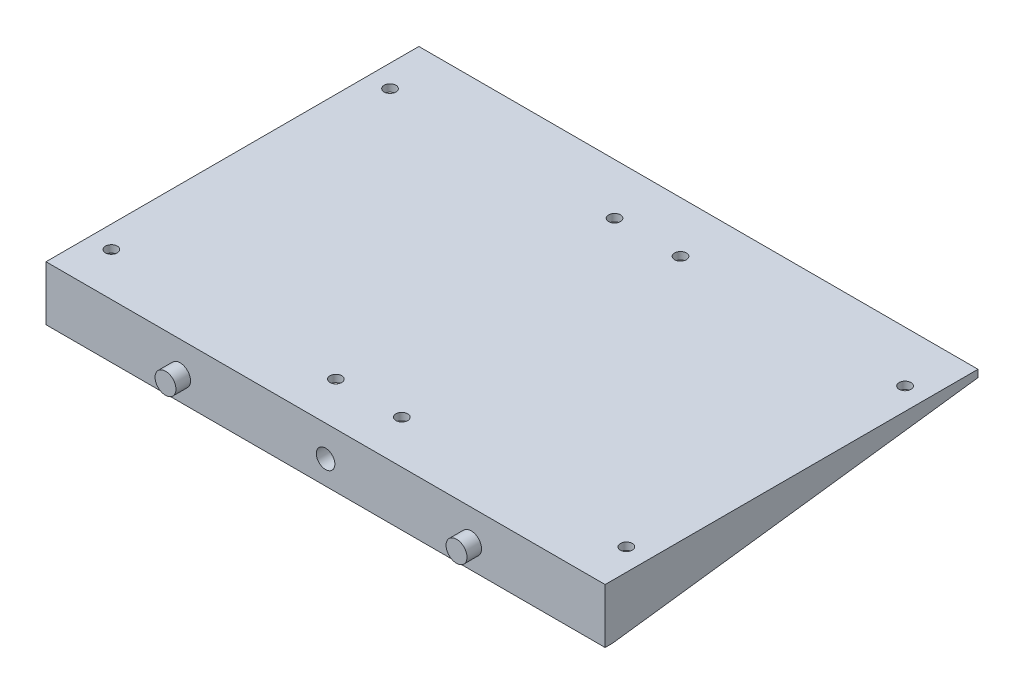
ISO-10303-21;
HEADER;
FILE_DESCRIPTION(('STEP AP214'),'2;1');
FILE_NAME('part.step','',(''),(''),'','','');
FILE_SCHEMA(('AUTOMOTIVE_DESIGN { 1 0 10303 214 1 1 1 1 }'));
ENDSEC;
DATA;
#1=APPLICATION_CONTEXT('core data for automotive mechanical design processes');
#2=APPLICATION_PROTOCOL_DEFINITION('international standard','automotive_design',2000,#1);
#3=PRODUCT_CONTEXT('',#1,'mechanical');
#4=PRODUCT('Part','Part','',(#3));
#5=PRODUCT_RELATED_PRODUCT_CATEGORY('part','',(#4));
#6=PRODUCT_DEFINITION_FORMATION('','',#4);
#7=PRODUCT_DEFINITION_CONTEXT('part definition',#1,'design');
#8=PRODUCT_DEFINITION('design','',#6,#7);
#9=PRODUCT_DEFINITION_SHAPE('','',#8);
#10=(LENGTH_UNIT() NAMED_UNIT(*) SI_UNIT(.MILLI.,.METRE.));
#11=(NAMED_UNIT(*) PLANE_ANGLE_UNIT() SI_UNIT($,.RADIAN.));
#12=(NAMED_UNIT(*) SI_UNIT($,.STERADIAN.) SOLID_ANGLE_UNIT());
#13=UNCERTAINTY_MEASURE_WITH_UNIT(LENGTH_MEASURE(1.E-05),#10,'distance_accuracy_value','');
#14=(GEOMETRIC_REPRESENTATION_CONTEXT(3) GLOBAL_UNCERTAINTY_ASSIGNED_CONTEXT((#13)) GLOBAL_UNIT_ASSIGNED_CONTEXT((#10,
#11,#12)) REPRESENTATION_CONTEXT('',''));
#15=CARTESIAN_POINT('',(0.,0.,0.));
#16=DIRECTION('',(0.,0.,1.));
#17=DIRECTION('',(1.,0.,0.));
#18=AXIS2_PLACEMENT_3D('',#15,#16,#17);
#19=CARTESIAN_POINT('',(0.,0.,0.));
#20=DIRECTION('',(0.,0.,1.));
#21=DIRECTION('',(1.,0.,0.));
#22=AXIS2_PLACEMENT_3D('',#19,#20,#21);
#23=PLANE('',#22);
#24=DIRECTION('',(0.,-1.,0.));
#25=VECTOR('',#24,1.);
#26=CARTESIAN_POINT('',(149.7,-13.,0.));
#27=LINE('',#26,#25);
#28=CARTESIAN_POINT('',(149.7,0.,0.));
#29=VERTEX_POINT('',#28);
#30=CARTESIAN_POINT('',(149.7,-13.,0.));
#31=VERTEX_POINT('',#30);
#32=EDGE_CURVE('E198',#29,#31,#27,.T.);
#33=ORIENTED_EDGE('',*,*,#32,.T.);
#34=DIRECTION('',(1.,0.,0.));
#35=VECTOR('',#34,1.);
#36=CARTESIAN_POINT('',(0.,-13.,0.));
#37=LINE('',#36,#35);
#38=CARTESIAN_POINT('',(0.,-13.,0.));
#39=VERTEX_POINT('',#38);
#40=EDGE_CURVE('E133',#39,#31,#37,.T.);
#41=ORIENTED_EDGE('',*,*,#40,.F.);
#42=DIRECTION('',(0.,1.,0.));
#43=VECTOR('',#42,1.);
#44=CARTESIAN_POINT('',(0.,0.,0.));
#45=LINE('',#44,#43);
#46=CARTESIAN_POINT('',(0.,0.,0.));
#47=VERTEX_POINT('',#46);
#48=EDGE_CURVE('E60',#39,#47,#45,.T.);
#49=ORIENTED_EDGE('',*,*,#48,.T.);
#50=DIRECTION('',(1.,0.,0.));
#51=VECTOR('',#50,1.);
#52=CARTESIAN_POINT('',(0.,0.,0.));
#53=LINE('',#52,#51);
#54=EDGE_CURVE('E182',#47,#29,#53,.T.);
#55=ORIENTED_EDGE('',*,*,#54,.T.);
#56=EDGE_LOOP('',(#33,#41,#49,#55));
#57=FACE_BOUND('',#56,.T.);
#58=CARTESIAN_POINT('',(74.85,-6.5,0.));
#59=DIRECTION('',(0.,0.,1.));
#60=DIRECTION('',(1.,0.,0.));
#61=AXIS2_PLACEMENT_3D('',#58,#59,#60);
#62=CIRCLE('',#61,4.00000000000001);
#63=CARTESIAN_POINT('',(78.85,-6.5,0.));
#64=VERTEX_POINT('',#63);
#65=EDGE_CURVE('E11',#64,#64,#62,.F.);
#66=ORIENTED_EDGE('',*,*,#65,.F.);
#67=EDGE_LOOP('',(#66));
#68=FACE_BOUND('',#67,.T.);
#69=ADVANCED_FACE('F37',(#57,#68),#23,.F.);
#70=CARTESIAN_POINT('',(0.,2.,-100.5));
#71=DIRECTION('',(0.,0.,-1.));
#72=DIRECTION('',(-1.,0.,0.));
#73=AXIS2_PLACEMENT_3D('',#70,#71,#72);
#74=PLANE('',#73);
#75=DIRECTION('',(1.,0.,0.));
#76=VECTOR('',#75,1.);
#77=CARTESIAN_POINT('',(0.,0.,-100.5));
#78=LINE('',#77,#76);
#79=CARTESIAN_POINT('',(0.,0.,-100.5));
#80=VERTEX_POINT('',#79);
#81=CARTESIAN_POINT('',(149.7,0.,-100.5));
#82=VERTEX_POINT('',#81);
#83=EDGE_CURVE('E52',#80,#82,#78,.T.);
#84=ORIENTED_EDGE('',*,*,#83,.F.);
#85=DIRECTION('',(1.,0.,0.));
#86=VECTOR('',#85,1.);
#87=CARTESIAN_POINT('',(-2.,0.,-100.5));
#88=LINE('',#87,#86);
#89=CARTESIAN_POINT('',(-2.,0.,-100.5));
#90=VERTEX_POINT('',#89);
#91=EDGE_CURVE('E231',#90,#80,#88,.T.);
#92=ORIENTED_EDGE('',*,*,#91,.F.);
#93=DIRECTION('',(0.,-1.,0.));
#94=VECTOR('',#93,1.);
#95=CARTESIAN_POINT('',(-2.,0.,-100.5));
#96=LINE('',#95,#94);
#97=CARTESIAN_POINT('',(-2.,2.,-100.5));
#98=VERTEX_POINT('',#97);
#99=EDGE_CURVE('E116',#98,#90,#96,.T.);
#100=ORIENTED_EDGE('',*,*,#99,.F.);
#101=DIRECTION('',(1.,0.,0.));
#102=VECTOR('',#101,1.);
#103=CARTESIAN_POINT('',(0.,2.,-100.5));
#104=LINE('',#103,#102);
#105=CARTESIAN_POINT('',(151.7,2.,-100.5));
#106=VERTEX_POINT('',#105);
#107=EDGE_CURVE('E113',#98,#106,#104,.T.);
#108=ORIENTED_EDGE('',*,*,#107,.T.);
#109=DIRECTION('',(0.,1.,0.));
#110=VECTOR('',#109,1.);
#111=CARTESIAN_POINT('',(151.7,2.,-100.5));
#112=LINE('',#111,#110);
#113=CARTESIAN_POINT('',(151.7,0.,-100.5));
#114=VERTEX_POINT('',#113);
#115=EDGE_CURVE('E215',#114,#106,#112,.T.);
#116=ORIENTED_EDGE('',*,*,#115,.F.);
#117=DIRECTION('',(-1.,0.,0.));
#118=VECTOR('',#117,1.);
#119=CARTESIAN_POINT('',(151.7,0.,-100.5));
#120=LINE('',#119,#118);
#121=EDGE_CURVE('E221',#114,#82,#120,.T.);
#122=ORIENTED_EDGE('',*,*,#121,.T.);
#123=EDGE_LOOP('',(#84,#92,#100,#108,#116,#122));
#124=FACE_BOUND('',#123,.T.);
#125=ADVANCED_FACE('F258',(#124),#74,.T.);
#126=CARTESIAN_POINT('',(83.92,2.,-9.90000000000002));
#127=DIRECTION('',(0.,-1.,0.));
#128=DIRECTION('',(0.,0.,-1.));
#129=AXIS2_PLACEMENT_3D('',#126,#127,#128);
#130=CYLINDRICAL_SURFACE('',#129,1.62499999999999);
#131=CARTESIAN_POINT('',(83.92,2.,-9.90000000000002));
#132=DIRECTION('',(0.,1.,0.));
#133=DIRECTION('',(0.,0.,1.));
#134=AXIS2_PLACEMENT_3D('',#131,#132,#133);
#135=CIRCLE('',#134,1.62499999999999);
#136=CARTESIAN_POINT('',(83.92,2.,-8.27500000000003));
#137=VERTEX_POINT('',#136);
#138=EDGE_CURVE('E163',#137,#137,#135,.T.);
#139=ORIENTED_EDGE('',*,*,#138,.T.);
#140=EDGE_LOOP('',(#139));
#141=FACE_BOUND('',#140,.T.);
#142=CARTESIAN_POINT('',(83.92,0.,-9.90000000000002));
#143=DIRECTION('',(0.,1.,0.));
#144=DIRECTION('',(0.,0.,1.));
#145=AXIS2_PLACEMENT_3D('',#142,#143,#144);
#146=CIRCLE('',#145,1.62499999999999);
#147=CARTESIAN_POINT('',(83.92,0.,-8.27500000000003));
#148=VERTEX_POINT('',#147);
#149=EDGE_CURVE('E192',#148,#148,#146,.T.);
#150=ORIENTED_EDGE('',*,*,#149,.F.);
#151=EDGE_LOOP('',(#150));
#152=FACE_BOUND('',#151,.T.);
#153=ADVANCED_FACE('F263',(#141,#152),#130,.F.);
#154=CARTESIAN_POINT('',(83.92,2.,-86.5));
#155=DIRECTION('',(0.,-1.,0.));
#156=DIRECTION('',(0.,0.,-1.));
#157=AXIS2_PLACEMENT_3D('',#154,#155,#156);
#158=CYLINDRICAL_SURFACE('',#157,1.62499999999999);
#159=CARTESIAN_POINT('',(83.92,2.,-86.5));
#160=DIRECTION('',(0.,1.,0.));
#161=DIRECTION('',(0.,0.,1.));
#162=AXIS2_PLACEMENT_3D('',#159,#160,#161);
#163=CIRCLE('',#162,1.62499999999999);
#164=CARTESIAN_POINT('',(83.92,2.,-84.875));
#165=VERTEX_POINT('',#164);
#166=EDGE_CURVE('E160',#165,#165,#163,.T.);
#167=ORIENTED_EDGE('',*,*,#166,.T.);
#168=EDGE_LOOP('',(#167));
#169=FACE_BOUND('',#168,.T.);
#170=CARTESIAN_POINT('',(83.92,0.,-86.5));
#171=DIRECTION('',(0.,1.,0.));
#172=DIRECTION('',(0.,0.,1.));
#173=AXIS2_PLACEMENT_3D('',#170,#171,#172);
#174=CIRCLE('',#173,1.62499999999999);
#175=CARTESIAN_POINT('',(83.92,0.,-84.875));
#176=VERTEX_POINT('',#175);
#177=EDGE_CURVE('E189',#176,#176,#174,.T.);
#178=ORIENTED_EDGE('',*,*,#177,.F.);
#179=EDGE_LOOP('',(#178));
#180=FACE_BOUND('',#179,.T.);
#181=ADVANCED_FACE('F280',(#169,#180),#158,.F.);
#182=CARTESIAN_POINT('',(145.64,2.,-86.5));
#183=DIRECTION('',(0.,-1.,0.));
#184=DIRECTION('',(0.,0.,-1.));
#185=AXIS2_PLACEMENT_3D('',#182,#183,#184);
#186=CYLINDRICAL_SURFACE('',#185,1.62499999999998);
#187=CARTESIAN_POINT('',(145.64,2.,-86.5));
#188=DIRECTION('',(0.,1.,0.));
#189=DIRECTION('',(0.,0.,1.));
#190=AXIS2_PLACEMENT_3D('',#187,#188,#189);
#191=CIRCLE('',#190,1.62499999999998);
#192=CARTESIAN_POINT('',(145.64,2.,-84.875));
#193=VERTEX_POINT('',#192);
#194=EDGE_CURVE('E157',#193,#193,#191,.T.);
#195=ORIENTED_EDGE('',*,*,#194,.T.);
#196=EDGE_LOOP('',(#195));
#197=FACE_BOUND('',#196,.T.);
#198=CARTESIAN_POINT('',(145.64,0.,-86.5));
#199=DIRECTION('',(0.,1.,0.));
#200=DIRECTION('',(0.,0.,1.));
#201=AXIS2_PLACEMENT_3D('',#198,#199,#200);
#202=CIRCLE('',#201,1.62499999999998);
#203=CARTESIAN_POINT('',(145.64,0.,-84.875));
#204=VERTEX_POINT('',#203);
#205=EDGE_CURVE('E186',#204,#204,#202,.T.);
#206=ORIENTED_EDGE('',*,*,#205,.F.);
#207=EDGE_LOOP('',(#206));
#208=FACE_BOUND('',#207,.T.);
#209=ADVANCED_FACE('F284',(#197,#208),#186,.F.);
#210=CARTESIAN_POINT('',(4.07,2.,-86.5));
#211=DIRECTION('',(0.,-1.,0.));
#212=DIRECTION('',(0.,0.,-1.));
#213=AXIS2_PLACEMENT_3D('',#210,#211,#212);
#214=CYLINDRICAL_SURFACE('',#213,1.625);
#215=CARTESIAN_POINT('',(4.07,2.,-86.5));
#216=DIRECTION('',(0.,1.,0.));
#217=DIRECTION('',(0.,0.,1.));
#218=AXIS2_PLACEMENT_3D('',#215,#216,#217);
#219=CIRCLE('',#218,1.625);
#220=CARTESIAN_POINT('',(4.07,2.,-84.875));
#221=VERTEX_POINT('',#220);
#222=EDGE_CURVE('E153',#221,#221,#219,.T.);
#223=ORIENTED_EDGE('',*,*,#222,.T.);
#224=EDGE_LOOP('',(#223));
#225=FACE_BOUND('',#224,.T.);
#226=CARTESIAN_POINT('',(4.07,0.,-86.5));
#227=DIRECTION('',(0.,1.,0.));
#228=DIRECTION('',(0.,0.,1.));
#229=AXIS2_PLACEMENT_3D('',#226,#227,#228);
#230=CIRCLE('',#229,1.625);
#231=CARTESIAN_POINT('',(4.07,0.,-84.875));
#232=VERTEX_POINT('',#231);
#233=EDGE_CURVE('E176',#232,#232,#230,.T.);
#234=ORIENTED_EDGE('',*,*,#233,.F.);
#235=EDGE_LOOP('',(#234));
#236=FACE_BOUND('',#235,.T.);
#237=ADVANCED_FACE('F287',(#225,#236),#214,.F.);
#238=CARTESIAN_POINT('',(65.79,2.,-86.5));
#239=DIRECTION('',(0.,-1.,0.));
#240=DIRECTION('',(0.,0.,-1.));
#241=AXIS2_PLACEMENT_3D('',#238,#239,#240);
#242=CYLINDRICAL_SURFACE('',#241,1.62499999999999);
#243=CARTESIAN_POINT('',(65.79,2.,-86.5));
#244=DIRECTION('',(0.,1.,0.));
#245=DIRECTION('',(0.,0.,1.));
#246=AXIS2_PLACEMENT_3D('',#243,#244,#245);
#247=CIRCLE('',#246,1.62499999999999);
#248=CARTESIAN_POINT('',(65.79,2.,-84.875));
#249=VERTEX_POINT('',#248);
#250=EDGE_CURVE('E150',#249,#249,#247,.T.);
#251=ORIENTED_EDGE('',*,*,#250,.T.);
#252=EDGE_LOOP('',(#251));
#253=FACE_BOUND('',#252,.T.);
#254=CARTESIAN_POINT('',(65.79,0.,-86.5));
#255=DIRECTION('',(0.,1.,0.));
#256=DIRECTION('',(0.,0.,1.));
#257=AXIS2_PLACEMENT_3D('',#254,#255,#256);
#258=CIRCLE('',#257,1.62499999999999);
#259=CARTESIAN_POINT('',(65.79,0.,-84.875));
#260=VERTEX_POINT('',#259);
#261=EDGE_CURVE('E173',#260,#260,#258,.T.);
#262=ORIENTED_EDGE('',*,*,#261,.F.);
#263=EDGE_LOOP('',(#262));
#264=FACE_BOUND('',#263,.T.);
#265=ADVANCED_FACE('F292',(#253,#264),#242,.F.);
#266=CARTESIAN_POINT('',(4.07,2.,-9.90000000000002));
#267=DIRECTION('',(0.,-1.,0.));
#268=DIRECTION('',(0.,0.,-1.));
#269=AXIS2_PLACEMENT_3D('',#266,#267,#268);
#270=CYLINDRICAL_SURFACE('',#269,1.625);
#271=CARTESIAN_POINT('',(4.07,2.,-9.90000000000002));
#272=DIRECTION('',(0.,1.,0.));
#273=DIRECTION('',(0.,0.,1.));
#274=AXIS2_PLACEMENT_3D('',#271,#272,#273);
#275=CIRCLE('',#274,1.625);
#276=CARTESIAN_POINT('',(4.07,2.,-8.27500000000002));
#277=VERTEX_POINT('',#276);
#278=EDGE_CURVE('E146',#277,#277,#275,.T.);
#279=ORIENTED_EDGE('',*,*,#278,.T.);
#280=EDGE_LOOP('',(#279));
#281=FACE_BOUND('',#280,.T.);
#282=CARTESIAN_POINT('',(4.07,0.,-9.90000000000002));
#283=DIRECTION('',(0.,1.,0.));
#284=DIRECTION('',(0.,0.,1.));
#285=AXIS2_PLACEMENT_3D('',#282,#283,#284);
#286=CIRCLE('',#285,1.625);
#287=CARTESIAN_POINT('',(4.07,0.,-8.27500000000002));
#288=VERTEX_POINT('',#287);
#289=EDGE_CURVE('E170',#288,#288,#286,.T.);
#290=ORIENTED_EDGE('',*,*,#289,.F.);
#291=EDGE_LOOP('',(#290));
#292=FACE_BOUND('',#291,.T.);
#293=ADVANCED_FACE('F295',(#281,#292),#270,.F.);
#294=CARTESIAN_POINT('',(65.79,2.,-9.90000000000002));
#295=DIRECTION('',(0.,-1.,0.));
#296=DIRECTION('',(0.,0.,-1.));
#297=AXIS2_PLACEMENT_3D('',#294,#295,#296);
#298=CYLINDRICAL_SURFACE('',#297,1.625);
#299=CARTESIAN_POINT('',(65.79,2.,-9.90000000000002));
#300=DIRECTION('',(0.,1.,0.));
#301=DIRECTION('',(0.,0.,1.));
#302=AXIS2_PLACEMENT_3D('',#299,#300,#301);
#303=CIRCLE('',#302,1.625);
#304=CARTESIAN_POINT('',(65.79,2.,-8.27500000000002));
#305=VERTEX_POINT('',#304);
#306=EDGE_CURVE('E143',#305,#305,#303,.T.);
#307=ORIENTED_EDGE('',*,*,#306,.T.);
#308=EDGE_LOOP('',(#307));
#309=FACE_BOUND('',#308,.T.);
#310=CARTESIAN_POINT('',(65.79,0.,-9.90000000000002));
#311=DIRECTION('',(0.,1.,0.));
#312=DIRECTION('',(0.,0.,1.));
#313=AXIS2_PLACEMENT_3D('',#310,#311,#312);
#314=CIRCLE('',#313,1.625);
#315=CARTESIAN_POINT('',(65.79,0.,-8.27500000000002));
#316=VERTEX_POINT('',#315);
#317=EDGE_CURVE('E135',#316,#316,#314,.T.);
#318=ORIENTED_EDGE('',*,*,#317,.F.);
#319=EDGE_LOOP('',(#318));
#320=FACE_BOUND('',#319,.T.);
#321=ADVANCED_FACE('F39',(#309,#320),#298,.F.);
#322=CARTESIAN_POINT('',(145.64,2.,-9.90000000000002));
#323=DIRECTION('',(0.,-1.,0.));
#324=DIRECTION('',(0.,0.,-1.));
#325=AXIS2_PLACEMENT_3D('',#322,#323,#324);
#326=CYLINDRICAL_SURFACE('',#325,1.625);
#327=CARTESIAN_POINT('',(145.64,2.,-9.90000000000002));
#328=DIRECTION('',(0.,1.,0.));
#329=DIRECTION('',(0.,0.,1.));
#330=AXIS2_PLACEMENT_3D('',#327,#328,#329);
#331=CIRCLE('',#330,1.625);
#332=CARTESIAN_POINT('',(145.64,2.,-8.27500000000002));
#333=VERTEX_POINT('',#332);
#334=EDGE_CURVE('E45',#333,#333,#331,.T.);
#335=ORIENTED_EDGE('',*,*,#334,.T.);
#336=EDGE_LOOP('',(#335));
#337=FACE_BOUND('',#336,.T.);
#338=CARTESIAN_POINT('',(145.64,0.,-9.90000000000002));
#339=DIRECTION('',(0.,1.,0.));
#340=DIRECTION('',(0.,0.,1.));
#341=AXIS2_PLACEMENT_3D('',#338,#339,#340);
#342=CIRCLE('',#341,1.625);
#343=CARTESIAN_POINT('',(145.64,0.,-8.27500000000002));
#344=VERTEX_POINT('',#343);
#345=EDGE_CURVE('E147',#344,#344,#342,.T.);
#346=ORIENTED_EDGE('',*,*,#345,.F.);
#347=EDGE_LOOP('',(#346));
#348=FACE_BOUND('',#347,.T.);
#349=ADVANCED_FACE('F271',(#337,#348),#326,.F.);
#350=CARTESIAN_POINT('',(0.,2.,0.));
#351=DIRECTION('',(0.,1.,0.));
#352=DIRECTION('',(0.,0.,1.));
#353=AXIS2_PLACEMENT_3D('',#350,#351,#352);
#354=PLANE('',#353);
#355=DIRECTION('',(1.,0.,0.));
#356=VECTOR('',#355,1.);
#357=CARTESIAN_POINT('',(0.,2.,2.));
#358=LINE('',#357,#356);
#359=CARTESIAN_POINT('',(-2.,2.,2.));
#360=VERTEX_POINT('',#359);
#361=CARTESIAN_POINT('',(151.7,2.,2.));
#362=VERTEX_POINT('',#361);
#363=EDGE_CURVE('E112',#360,#362,#358,.T.);
#364=ORIENTED_EDGE('',*,*,#363,.T.);
#365=DIRECTION('',(0.,0.,1.));
#366=VECTOR('',#365,1.);
#367=CARTESIAN_POINT('',(151.7,2.,0.));
#368=LINE('',#367,#366);
#369=EDGE_CURVE('E218',#106,#362,#368,.T.);
#370=ORIENTED_EDGE('',*,*,#369,.F.);
#371=ORIENTED_EDGE('',*,*,#107,.F.);
#372=DIRECTION('',(0.,0.,-1.));
#373=VECTOR('',#372,1.);
#374=CARTESIAN_POINT('',(-2.,2.,0.));
#375=LINE('',#374,#373);
#376=EDGE_CURVE('E106',#360,#98,#375,.T.);
#377=ORIENTED_EDGE('',*,*,#376,.F.);
#378=EDGE_LOOP('',(#364,#370,#371,#377));
#379=FACE_BOUND('',#378,.T.);
#380=ORIENTED_EDGE('',*,*,#306,.F.);
#381=EDGE_LOOP('',(#380));
#382=FACE_BOUND('',#381,.T.);
#383=ORIENTED_EDGE('',*,*,#278,.F.);
#384=EDGE_LOOP('',(#383));
#385=FACE_BOUND('',#384,.T.);
#386=ORIENTED_EDGE('',*,*,#250,.F.);
#387=EDGE_LOOP('',(#386));
#388=FACE_BOUND('',#387,.T.);
#389=ORIENTED_EDGE('',*,*,#222,.F.);
#390=EDGE_LOOP('',(#389));
#391=FACE_BOUND('',#390,.T.);
#392=ORIENTED_EDGE('',*,*,#194,.F.);
#393=EDGE_LOOP('',(#392));
#394=FACE_BOUND('',#393,.T.);
#395=ORIENTED_EDGE('',*,*,#166,.F.);
#396=EDGE_LOOP('',(#395));
#397=FACE_BOUND('',#396,.T.);
#398=ORIENTED_EDGE('',*,*,#138,.F.);
#399=EDGE_LOOP('',(#398));
#400=FACE_BOUND('',#399,.T.);
#401=ORIENTED_EDGE('',*,*,#334,.F.);
#402=EDGE_LOOP('',(#401));
#403=FACE_BOUND('',#402,.T.);
#404=ADVANCED_FACE('F108',(#379,#382,#385,#388,#391,#394,#397,#400,#403),#354,.T.);
#405=CARTESIAN_POINT('',(0.,0.,0.));
#406=DIRECTION('',(0.,1.,0.));
#407=DIRECTION('',(0.,0.,1.));
#408=AXIS2_PLACEMENT_3D('',#405,#406,#407);
#409=PLANE('',#408);
#410=ORIENTED_EDGE('',*,*,#317,.T.);
#411=EDGE_LOOP('',(#410));
#412=FACE_BOUND('',#411,.T.);
#413=ORIENTED_EDGE('',*,*,#289,.T.);
#414=EDGE_LOOP('',(#413));
#415=FACE_BOUND('',#414,.T.);
#416=ORIENTED_EDGE('',*,*,#261,.T.);
#417=EDGE_LOOP('',(#416));
#418=FACE_BOUND('',#417,.T.);
#419=ORIENTED_EDGE('',*,*,#233,.T.);
#420=EDGE_LOOP('',(#419));
#421=FACE_BOUND('',#420,.T.);
#422=ORIENTED_EDGE('',*,*,#83,.T.);
#423=DIRECTION('',(0.,0.,-1.));
#424=VECTOR('',#423,1.);
#425=CARTESIAN_POINT('',(149.7,0.,0.));
#426=LINE('',#425,#424);
#427=EDGE_CURVE('E184',#29,#82,#426,.T.);
#428=ORIENTED_EDGE('',*,*,#427,.F.);
#429=ORIENTED_EDGE('',*,*,#54,.F.);
#430=DIRECTION('',(0.,0.,-1.));
#431=VECTOR('',#430,1.);
#432=CARTESIAN_POINT('',(0.,0.,0.));
#433=LINE('',#432,#431);
#434=EDGE_CURVE('E180',#47,#80,#433,.T.);
#435=ORIENTED_EDGE('',*,*,#434,.T.);
#436=EDGE_LOOP('',(#422,#428,#429,#435));
#437=FACE_BOUND('',#436,.T.);
#438=ORIENTED_EDGE('',*,*,#205,.T.);
#439=EDGE_LOOP('',(#438));
#440=FACE_BOUND('',#439,.T.);
#441=ORIENTED_EDGE('',*,*,#177,.T.);
#442=EDGE_LOOP('',(#441));
#443=FACE_BOUND('',#442,.T.);
#444=ORIENTED_EDGE('',*,*,#149,.T.);
#445=EDGE_LOOP('',(#444));
#446=FACE_BOUND('',#445,.T.);
#447=ORIENTED_EDGE('',*,*,#345,.T.);
#448=EDGE_LOOP('',(#447));
#449=FACE_BOUND('',#448,.T.);
#450=ADVANCED_FACE('F268',(#412,#415,#418,#421,#437,#440,#443,#446,#449),#409,.F.);
#451=CARTESIAN_POINT('',(0.,-13.,2.));
#452=DIRECTION('',(0.,1.,0.));
#453=DIRECTION('',(0.,0.,1.));
#454=AXIS2_PLACEMENT_3D('',#451,#452,#453);
#455=PLANE('',#454);
#456=DIRECTION('',(-1.,0.,0.));
#457=VECTOR('',#456,1.);
#458=CARTESIAN_POINT('',(151.7,-13.,0.));
#459=LINE('',#458,#457);
#460=CARTESIAN_POINT('',(151.7,-13.,0.));
#461=VERTEX_POINT('',#460);
#462=EDGE_CURVE('E226',#461,#31,#459,.T.);
#463=ORIENTED_EDGE('',*,*,#462,.F.);
#464=DIRECTION('',(0.,0.,1.));
#465=VECTOR('',#464,1.);
#466=CARTESIAN_POINT('',(151.7,-13.,2.));
#467=LINE('',#466,#465);
#468=CARTESIAN_POINT('',(151.7,-13.,2.));
#469=VERTEX_POINT('',#468);
#470=EDGE_CURVE('E335',#461,#469,#467,.T.);
#471=ORIENTED_EDGE('',*,*,#470,.T.);
#472=DIRECTION('',(1.,0.,0.));
#473=VECTOR('',#472,1.);
#474=CARTESIAN_POINT('',(0.,-13.,2.));
#475=LINE('',#474,#473);
#476=CARTESIAN_POINT('',(-2.,-13.,2.));
#477=VERTEX_POINT('',#476);
#478=EDGE_CURVE('E132',#477,#469,#475,.T.);
#479=ORIENTED_EDGE('',*,*,#478,.F.);
#480=DIRECTION('',(0.,0.,-1.));
#481=VECTOR('',#480,1.);
#482=CARTESIAN_POINT('',(-2.,-13.,2.));
#483=LINE('',#482,#481);
#484=CARTESIAN_POINT('',(-2.,-13.,0.));
#485=VERTEX_POINT('',#484);
#486=EDGE_CURVE('E123',#477,#485,#483,.T.);
#487=ORIENTED_EDGE('',*,*,#486,.T.);
#488=DIRECTION('',(1.,0.,0.));
#489=VECTOR('',#488,1.);
#490=CARTESIAN_POINT('',(-2.,-13.,0.));
#491=LINE('',#490,#489);
#492=EDGE_CURVE('E138',#485,#39,#491,.T.);
#493=ORIENTED_EDGE('',*,*,#492,.T.);
#494=ORIENTED_EDGE('',*,*,#40,.T.);
#495=EDGE_LOOP('',(#463,#471,#479,#487,#493,#494));
#496=FACE_BOUND('',#495,.T.);
#497=ADVANCED_FACE('F241',(#496),#455,.F.);
#498=CARTESIAN_POINT('',(0.,0.,2.));
#499=DIRECTION('',(0.,0.,1.));
#500=DIRECTION('',(1.,0.,0.));
#501=AXIS2_PLACEMENT_3D('',#498,#499,#500);
#502=PLANE('',#501);
#503=DIRECTION('',(0.,-1.,0.));
#504=VECTOR('',#503,1.);
#505=CARTESIAN_POINT('',(151.7,0.,2.));
#506=LINE('',#505,#504);
#507=EDGE_CURVE('E127',#362,#469,#506,.T.);
#508=ORIENTED_EDGE('',*,*,#507,.F.);
#509=ORIENTED_EDGE('',*,*,#363,.F.);
#510=DIRECTION('',(0.,1.,0.));
#511=VECTOR('',#510,1.);
#512=CARTESIAN_POINT('',(-2.,0.,2.));
#513=LINE('',#512,#511);
#514=EDGE_CURVE('E120',#477,#360,#513,.T.);
#515=ORIENTED_EDGE('',*,*,#514,.F.);
#516=ORIENTED_EDGE('',*,*,#478,.T.);
#517=EDGE_LOOP('',(#508,#509,#515,#516));
#518=FACE_BOUND('',#517,.T.);
#519=CARTESIAN_POINT('',(34.85,-6.5,2.));
#520=DIRECTION('',(0.,0.,1.));
#521=DIRECTION('',(1.,0.,0.));
#522=AXIS2_PLACEMENT_3D('',#519,#520,#521);
#523=CIRCLE('',#522,2.875);
#524=CARTESIAN_POINT('',(37.725,-6.5,2.));
#525=VERTEX_POINT('',#524);
#526=EDGE_CURVE('E341',#525,#525,#523,.T.);
#527=ORIENTED_EDGE('',*,*,#526,.F.);
#528=EDGE_LOOP('',(#527));
#529=FACE_BOUND('',#528,.T.);
#530=CARTESIAN_POINT('',(114.85,-6.5,2.));
#531=DIRECTION('',(0.,0.,1.));
#532=DIRECTION('',(1.,0.,0.));
#533=AXIS2_PLACEMENT_3D('',#530,#531,#532);
#534=CIRCLE('',#533,2.875);
#535=CARTESIAN_POINT('',(117.725,-6.5,2.));
#536=VERTEX_POINT('',#535);
#537=EDGE_CURVE('E344',#536,#536,#534,.T.);
#538=ORIENTED_EDGE('',*,*,#537,.F.);
#539=EDGE_LOOP('',(#538));
#540=FACE_BOUND('',#539,.T.);
#541=CARTESIAN_POINT('',(74.85,-6.5,2.));
#542=DIRECTION('',(0.,0.,1.));
#543=DIRECTION('',(1.,0.,0.));
#544=AXIS2_PLACEMENT_3D('',#541,#542,#543);
#545=CIRCLE('',#544,2.54999999999999);
#546=CARTESIAN_POINT('',(77.4,-6.5,2.));
#547=VERTEX_POINT('',#546);
#548=EDGE_CURVE('E196',#547,#547,#545,.T.);
#549=ORIENTED_EDGE('',*,*,#548,.F.);
#550=EDGE_LOOP('',(#549));
#551=FACE_BOUND('',#550,.T.);
#552=ADVANCED_FACE('F130',(#518,#529,#540,#551),#502,.T.);
#553=CARTESIAN_POINT('',(0.,0.,0.));
#554=DIRECTION('',(-1.,0.,0.));
#555=DIRECTION('',(0.,0.,1.));
#556=AXIS2_PLACEMENT_3D('',#553,#554,#555);
#557=PLANE('',#556);
#558=DIRECTION('',(0.,-0.128284441850094,0.991737415841114));
#559=VECTOR('',#558,1.);
#560=CARTESIAN_POINT('',(0.,-12.7860603257297,-1.65391825108942));
#561=LINE('',#560,#559);
#562=EDGE_CURVE('E228',#80,#39,#561,.T.);
#563=ORIENTED_EDGE('',*,*,#562,.F.);
#564=ORIENTED_EDGE('',*,*,#434,.F.);
#565=ORIENTED_EDGE('',*,*,#48,.F.);
#566=EDGE_LOOP('',(#563,#564,#565));
#567=FACE_BOUND('',#566,.T.);
#568=ADVANCED_FACE('F245',(#567),#557,.F.);
#569=CARTESIAN_POINT('',(-2.,-12.7860603257297,-1.65391825108942));
#570=DIRECTION('',(0.,0.991737415841114,0.128284441850094));
#571=DIRECTION('',(0.,-0.128284441850094,0.991737415841114));
#572=AXIS2_PLACEMENT_3D('',#569,#570,#571);
#573=PLANE('',#572);
#574=ORIENTED_EDGE('',*,*,#562,.T.);
#575=ORIENTED_EDGE('',*,*,#492,.F.);
#576=DIRECTION('',(0.,-0.128284441850094,0.991737415841114));
#577=VECTOR('',#576,1.);
#578=CARTESIAN_POINT('',(-2.,-12.7860603257297,-1.65391825108942));
#579=LINE('',#578,#577);
#580=EDGE_CURVE('E117',#90,#485,#579,.T.);
#581=ORIENTED_EDGE('',*,*,#580,.F.);
#582=ORIENTED_EDGE('',*,*,#91,.T.);
#583=EDGE_LOOP('',(#574,#575,#581,#582));
#584=FACE_BOUND('',#583,.T.);
#585=ADVANCED_FACE('F246',(#584),#573,.F.);
#586=CARTESIAN_POINT('',(-2.,0.,0.));
#587=DIRECTION('',(-1.,0.,0.));
#588=DIRECTION('',(0.,0.,1.));
#589=AXIS2_PLACEMENT_3D('',#586,#587,#588);
#590=PLANE('',#589);
#591=ORIENTED_EDGE('',*,*,#580,.T.);
#592=ORIENTED_EDGE('',*,*,#486,.F.);
#593=ORIENTED_EDGE('',*,*,#514,.T.);
#594=ORIENTED_EDGE('',*,*,#376,.T.);
#595=ORIENTED_EDGE('',*,*,#99,.T.);
#596=EDGE_LOOP('',(#591,#592,#593,#594,#595));
#597=FACE_BOUND('',#596,.T.);
#598=ADVANCED_FACE('F121',(#597),#590,.T.);
#599=CARTESIAN_POINT('',(149.7,0.,0.));
#600=DIRECTION('',(1.,0.,0.));
#601=DIRECTION('',(0.,0.,-1.));
#602=AXIS2_PLACEMENT_3D('',#599,#600,#601);
#603=PLANE('',#602);
#604=ORIENTED_EDGE('',*,*,#32,.F.);
#605=ORIENTED_EDGE('',*,*,#427,.T.);
#606=DIRECTION('',(0.,0.128284441850094,-0.991737415841113));
#607=VECTOR('',#606,1.);
#608=CARTESIAN_POINT('',(149.7,0.,-100.5));
#609=LINE('',#608,#607);
#610=EDGE_CURVE('E203',#31,#82,#609,.T.);
#611=ORIENTED_EDGE('',*,*,#610,.F.);
#612=EDGE_LOOP('',(#604,#605,#611));
#613=FACE_BOUND('',#612,.T.);
#614=ADVANCED_FACE('F253',(#613),#603,.F.);
#615=CARTESIAN_POINT('',(151.7,0.,-100.5));
#616=DIRECTION('',(0.,0.991737415841114,0.128284441850094));
#617=DIRECTION('',(0.,-0.128284441850094,0.991737415841114));
#618=AXIS2_PLACEMENT_3D('',#615,#616,#617);
#619=PLANE('',#618);
#620=ORIENTED_EDGE('',*,*,#610,.T.);
#621=ORIENTED_EDGE('',*,*,#121,.F.);
#622=DIRECTION('',(0.,0.128284441850094,-0.991737415841113));
#623=VECTOR('',#622,1.);
#624=CARTESIAN_POINT('',(151.7,0.,-100.5));
#625=LINE('',#624,#623);
#626=EDGE_CURVE('E220',#461,#114,#625,.T.);
#627=ORIENTED_EDGE('',*,*,#626,.F.);
#628=ORIENTED_EDGE('',*,*,#462,.T.);
#629=EDGE_LOOP('',(#620,#621,#627,#628));
#630=FACE_BOUND('',#629,.T.);
#631=ADVANCED_FACE('F329',(#630),#619,.F.);
#632=CARTESIAN_POINT('',(151.7,0.,0.));
#633=DIRECTION('',(1.,0.,0.));
#634=DIRECTION('',(0.,0.,-1.));
#635=AXIS2_PLACEMENT_3D('',#632,#633,#634);
#636=PLANE('',#635);
#637=ORIENTED_EDGE('',*,*,#369,.T.);
#638=ORIENTED_EDGE('',*,*,#507,.T.);
#639=ORIENTED_EDGE('',*,*,#470,.F.);
#640=ORIENTED_EDGE('',*,*,#626,.T.);
#641=ORIENTED_EDGE('',*,*,#115,.T.);
#642=EDGE_LOOP('',(#637,#638,#639,#640,#641));
#643=FACE_BOUND('',#642,.T.);
#644=ADVANCED_FACE('F333',(#643),#636,.T.);
#645=CARTESIAN_POINT('',(74.85,-6.5,10.));
#646=DIRECTION('',(0.,0.,-1.));
#647=DIRECTION('',(-1.,0.,0.));
#648=AXIS2_PLACEMENT_3D('',#645,#646,#647);
#649=CYLINDRICAL_SURFACE('',#648,2.54999999999999);
#650=ORIENTED_EDGE('',*,*,#548,.T.);
#651=EDGE_LOOP('',(#650));
#652=FACE_BOUND('',#651,.T.);
#653=CARTESIAN_POINT('',(74.85,-6.5,-3.));
#654=DIRECTION('',(0.,0.,-1.));
#655=DIRECTION('',(-1.,0.,0.));
#656=AXIS2_PLACEMENT_3D('',#653,#654,#655);
#657=CIRCLE('',#656,2.54999999999999);
#658=CARTESIAN_POINT('',(72.3,-6.5,-3.));
#659=VERTEX_POINT('',#658);
#660=EDGE_CURVE('E206',#659,#659,#657,.T.);
#661=ORIENTED_EDGE('',*,*,#660,.T.);
#662=EDGE_LOOP('',(#661));
#663=FACE_BOUND('',#662,.T.);
#664=ADVANCED_FACE('F407',(#652,#663),#649,.F.);
#665=CARTESIAN_POINT('',(74.85,-6.5,-3.));
#666=DIRECTION('',(0.,0.,-1.));
#667=DIRECTION('',(-1.,0.,0.));
#668=AXIS2_PLACEMENT_3D('',#665,#666,#667);
#669=PLANE('',#668);
#670=CARTESIAN_POINT('',(74.85,-6.5,-3.));
#671=DIRECTION('',(0.,0.,-1.));
#672=DIRECTION('',(-1.,0.,0.));
#673=AXIS2_PLACEMENT_3D('',#670,#671,#672);
#674=CIRCLE('',#673,4.00000000000001);
#675=CARTESIAN_POINT('',(70.85,-6.5,-3.));
#676=VERTEX_POINT('',#675);
#677=EDGE_CURVE('E199',#676,#676,#674,.T.);
#678=ORIENTED_EDGE('',*,*,#677,.T.);
#679=EDGE_LOOP('',(#678));
#680=FACE_BOUND('',#679,.T.);
#681=ORIENTED_EDGE('',*,*,#660,.F.);
#682=EDGE_LOOP('',(#681));
#683=FACE_BOUND('',#682,.T.);
#684=ADVANCED_FACE('F411',(#680,#683),#669,.T.);
#685=CARTESIAN_POINT('',(74.85,-6.5,-3.));
#686=DIRECTION('',(0.,0.,1.));
#687=DIRECTION('',(1.,0.,0.));
#688=AXIS2_PLACEMENT_3D('',#685,#686,#687);
#689=CYLINDRICAL_SURFACE('',#688,4.00000000000001);
#690=ORIENTED_EDGE('',*,*,#677,.F.);
#691=EDGE_LOOP('',(#690));
#692=FACE_BOUND('',#691,.T.);
#693=ORIENTED_EDGE('',*,*,#65,.T.);
#694=EDGE_LOOP('',(#693));
#695=FACE_BOUND('',#694,.T.);
#696=ADVANCED_FACE('F422',(#692,#695),#689,.T.);
#697=CARTESIAN_POINT('',(114.85,-6.5,6.));
#698=DIRECTION('',(0.,0.,-1.));
#699=DIRECTION('',(-1.,0.,0.));
#700=AXIS2_PLACEMENT_3D('',#697,#698,#699);
#701=CYLINDRICAL_SURFACE('',#700,2.875);
#702=CARTESIAN_POINT('',(114.85,-6.5,6.));
#703=DIRECTION('',(0.,0.,1.));
#704=DIRECTION('',(1.,0.,0.));
#705=AXIS2_PLACEMENT_3D('',#702,#703,#704);
#706=CIRCLE('',#705,2.875);
#707=CARTESIAN_POINT('',(117.725,-6.5,6.));
#708=VERTEX_POINT('',#707);
#709=EDGE_CURVE('E211',#708,#708,#706,.T.);
#710=ORIENTED_EDGE('',*,*,#709,.F.);
#711=EDGE_LOOP('',(#710));
#712=FACE_BOUND('',#711,.T.);
#713=ORIENTED_EDGE('',*,*,#537,.T.);
#714=EDGE_LOOP('',(#713));
#715=FACE_BOUND('',#714,.T.);
#716=ADVANCED_FACE('F351',(#712,#715),#701,.T.);
#717=CARTESIAN_POINT('',(0.,0.,6.));
#718=DIRECTION('',(0.,0.,1.));
#719=DIRECTION('',(1.,0.,0.));
#720=AXIS2_PLACEMENT_3D('',#717,#718,#719);
#721=PLANE('',#720);
#722=ORIENTED_EDGE('',*,*,#709,.T.);
#723=EDGE_LOOP('',(#722));
#724=FACE_BOUND('',#723,.T.);
#725=ADVANCED_FACE('F440',(#724),#721,.T.);
#726=CARTESIAN_POINT('',(34.85,-6.5,6.));
#727=DIRECTION('',(0.,0.,-1.));
#728=DIRECTION('',(-1.,0.,0.));
#729=AXIS2_PLACEMENT_3D('',#726,#727,#728);
#730=CYLINDRICAL_SURFACE('',#729,2.875);
#731=CARTESIAN_POINT('',(34.85,-6.5,6.));
#732=DIRECTION('',(0.,0.,1.));
#733=DIRECTION('',(1.,0.,0.));
#734=AXIS2_PLACEMENT_3D('',#731,#732,#733);
#735=CIRCLE('',#734,2.875);
#736=CARTESIAN_POINT('',(37.725,-6.5,6.));
#737=VERTEX_POINT('',#736);
#738=EDGE_CURVE('E339',#737,#737,#735,.T.);
#739=ORIENTED_EDGE('',*,*,#738,.F.);
#740=EDGE_LOOP('',(#739));
#741=FACE_BOUND('',#740,.T.);
#742=ORIENTED_EDGE('',*,*,#526,.T.);
#743=EDGE_LOOP('',(#742));
#744=FACE_BOUND('',#743,.T.);
#745=ADVANCED_FACE('F450',(#741,#744),#730,.T.);
#746=CARTESIAN_POINT('',(34.85,-6.5,6.));
#747=DIRECTION('',(0.,0.,1.));
#748=DIRECTION('',(1.,0.,0.));
#749=AXIS2_PLACEMENT_3D('',#746,#747,#748);
#750=PLANE('',#749);
#751=ORIENTED_EDGE('',*,*,#738,.T.);
#752=EDGE_LOOP('',(#751));
#753=FACE_BOUND('',#752,.T.);
#754=ADVANCED_FACE('F460',(#753),#750,.T.);
#755=CLOSED_SHELL('',(#69,#125,#153,#181,#209,#237,#265,#293,#321,#349,#404,#450,#497,#552,#568,
#585,#598,#614,#631,#644,#664,#684,#696,#716,#725,#745,#754));
#756=MANIFOLD_SOLID_BREP('B2',#755);
#757=ADVANCED_BREP_SHAPE_REPRESENTATION('',(#18,#756),#14);
#758=SHAPE_DEFINITION_REPRESENTATION(#9,#757);
ENDSEC;
END-ISO-10303-21;
